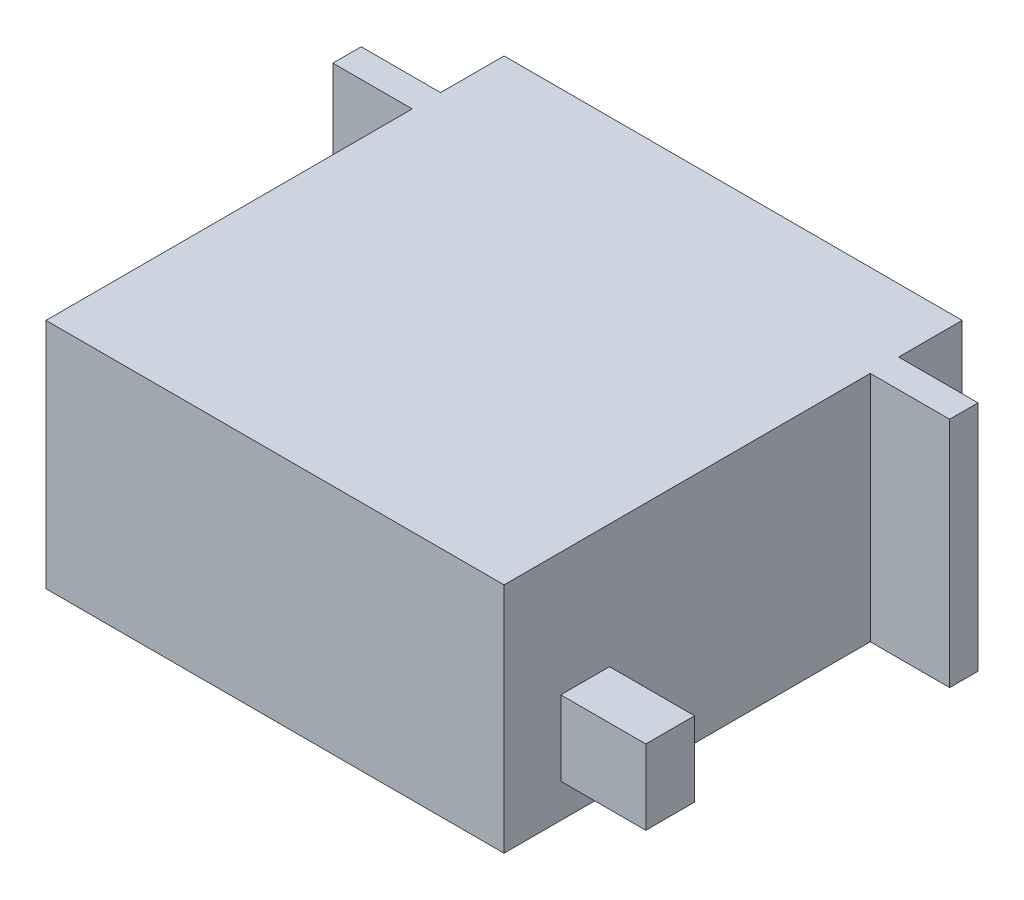
ISO-10303-21;
HEADER;
FILE_DESCRIPTION(('STEP AP214'),'2;1');
FILE_NAME('part.step','',(''),(''),'','','');
FILE_SCHEMA(('AUTOMOTIVE_DESIGN { 1 0 10303 214 1 1 1 1 }'));
ENDSEC;
DATA;
#1=APPLICATION_CONTEXT('core data for automotive mechanical design processes');
#2=APPLICATION_PROTOCOL_DEFINITION('international standard','automotive_design',2000,#1);
#3=PRODUCT_CONTEXT('',#1,'mechanical');
#4=PRODUCT('Part','Part','',(#3));
#5=PRODUCT_RELATED_PRODUCT_CATEGORY('part','',(#4));
#6=PRODUCT_DEFINITION_FORMATION('','',#4);
#7=PRODUCT_DEFINITION_CONTEXT('part definition',#1,'design');
#8=PRODUCT_DEFINITION('design','',#6,#7);
#9=PRODUCT_DEFINITION_SHAPE('','',#8);
#10=(LENGTH_UNIT() NAMED_UNIT(*) SI_UNIT(.MILLI.,.METRE.));
#11=(NAMED_UNIT(*) PLANE_ANGLE_UNIT() SI_UNIT($,.RADIAN.));
#12=(NAMED_UNIT(*) SI_UNIT($,.STERADIAN.) SOLID_ANGLE_UNIT());
#13=UNCERTAINTY_MEASURE_WITH_UNIT(LENGTH_MEASURE(1.E-05),#10,'distance_accuracy_value','');
#14=(GEOMETRIC_REPRESENTATION_CONTEXT(3) GLOBAL_UNCERTAINTY_ASSIGNED_CONTEXT((#13)) GLOBAL_UNIT_ASSIGNED_CONTEXT((#10,
#11,#12)) REPRESENTATION_CONTEXT('',''));
#15=CARTESIAN_POINT('',(0.,0.,0.));
#16=DIRECTION('',(0.,0.,1.));
#17=DIRECTION('',(1.,0.,0.));
#18=AXIS2_PLACEMENT_3D('',#15,#16,#17);
#19=CARTESIAN_POINT('',(17.745348870086,20.5,0.));
#20=DIRECTION('',(1.,0.,0.));
#21=DIRECTION('',(0.,0.,-1.));
#22=AXIS2_PLACEMENT_3D('',#19,#20,#21);
#23=PLANE('',#22);
#24=DIRECTION('',(0.,0.,1.));
#25=VECTOR('',#24,1.);
#26=CARTESIAN_POINT('',(17.745348870086,0.,0.));
#27=LINE('',#26,#25);
#28=CARTESIAN_POINT('',(17.745348870086,0.,-3.96373257406587));
#29=VERTEX_POINT('',#28);
#30=CARTESIAN_POINT('',(17.745348870086,0.,28.3362674259341));
#31=VERTEX_POINT('',#30);
#32=EDGE_CURVE('E199',#29,#31,#27,.T.);
#33=ORIENTED_EDGE('',*,*,#32,.F.);
#34=DIRECTION('',(0.,-1.,0.));
#35=VECTOR('',#34,1.);
#36=CARTESIAN_POINT('',(17.745348870086,20.5,-3.96373257406587));
#37=LINE('',#36,#35);
#38=CARTESIAN_POINT('',(17.745348870086,20.5,-3.96373257406587));
#39=VERTEX_POINT('',#38);
#40=EDGE_CURVE('E238',#39,#29,#37,.T.);
#41=ORIENTED_EDGE('',*,*,#40,.F.);
#42=DIRECTION('',(0.,0.,1.));
#43=VECTOR('',#42,1.);
#44=CARTESIAN_POINT('',(17.745348870086,20.5,0.));
#45=LINE('',#44,#43);
#46=CARTESIAN_POINT('',(17.745348870086,20.5,28.3362674259341));
#47=VERTEX_POINT('',#46);
#48=EDGE_CURVE('E178',#39,#47,#45,.T.);
#49=ORIENTED_EDGE('',*,*,#48,.T.);
#50=DIRECTION('',(0.,-1.,0.));
#51=VECTOR('',#50,1.);
#52=CARTESIAN_POINT('',(17.745348870086,20.5,28.3362674259341));
#53=LINE('',#52,#51);
#54=EDGE_CURVE('E241',#47,#31,#53,.T.);
#55=ORIENTED_EDGE('',*,*,#54,.T.);
#56=EDGE_LOOP('',(#33,#41,#49,#55));
#57=FACE_BOUND('',#56,.T.);
#58=DIRECTION('',(0.,0.,1.));
#59=VECTOR('',#58,1.);
#60=CARTESIAN_POINT('',(17.745348870086,9.6,19.0362674259341));
#61=LINE('',#60,#59);
#62=CARTESIAN_POINT('',(17.745348870086,9.6,19.0362674259341));
#63=VERTEX_POINT('',#62);
#64=CARTESIAN_POINT('',(17.745348870086,9.6,23.3362674259341));
#65=VERTEX_POINT('',#64);
#66=EDGE_CURVE('E328',#63,#65,#61,.T.);
#67=ORIENTED_EDGE('',*,*,#66,.F.);
#68=DIRECTION('',(0.,1.,0.));
#69=VECTOR('',#68,1.);
#70=CARTESIAN_POINT('',(17.745348870086,9.6,19.0362674259341));
#71=LINE('',#70,#69);
#72=CARTESIAN_POINT('',(17.745348870086,3.,19.0362674259341));
#73=VERTEX_POINT('',#72);
#74=EDGE_CURVE('E332',#73,#63,#71,.T.);
#75=ORIENTED_EDGE('',*,*,#74,.F.);
#76=DIRECTION('',(0.,0.,-1.));
#77=VECTOR('',#76,1.);
#78=CARTESIAN_POINT('',(17.745348870086,3.,19.0362674259341));
#79=LINE('',#78,#77);
#80=CARTESIAN_POINT('',(17.745348870086,3.,23.3362674259341));
#81=VERTEX_POINT('',#80);
#82=EDGE_CURVE('E322',#81,#73,#79,.T.);
#83=ORIENTED_EDGE('',*,*,#82,.F.);
#84=DIRECTION('',(0.,-1.,0.));
#85=VECTOR('',#84,1.);
#86=CARTESIAN_POINT('',(17.745348870086,9.6,23.3362674259341));
#87=LINE('',#86,#85);
#88=EDGE_CURVE('E325',#65,#81,#87,.T.);
#89=ORIENTED_EDGE('',*,*,#88,.F.);
#90=EDGE_LOOP('',(#67,#75,#83,#89));
#91=FACE_BOUND('',#90,.T.);
#92=ADVANCED_FACE('F39',(#57,#91),#23,.T.);
#93=CARTESIAN_POINT('',(-29.654651129914,20.5,0.));
#94=DIRECTION('',(1.,0.,0.));
#95=DIRECTION('',(0.,0.,-1.));
#96=AXIS2_PLACEMENT_3D('',#93,#94,#95);
#97=PLANE('',#96);
#98=DIRECTION('',(0.,0.,1.));
#99=VECTOR('',#98,1.);
#100=CARTESIAN_POINT('',(-29.654651129914,0.,0.));
#101=LINE('',#100,#99);
#102=CARTESIAN_POINT('',(-29.654651129914,0.,-6.46373257406587));
#103=VERTEX_POINT('',#102);
#104=CARTESIAN_POINT('',(-29.654651129914,0.,-3.96373257406587));
#105=VERTEX_POINT('',#104);
#106=EDGE_CURVE('E184',#103,#105,#101,.T.);
#107=ORIENTED_EDGE('',*,*,#106,.T.);
#108=DIRECTION('',(0.,-1.,0.));
#109=VECTOR('',#108,1.);
#110=CARTESIAN_POINT('',(-29.654651129914,20.5,-3.96373257406587));
#111=LINE('',#110,#109);
#112=CARTESIAN_POINT('',(-29.654651129914,20.5,-3.96373257406587));
#113=VERTEX_POINT('',#112);
#114=EDGE_CURVE('E11',#113,#105,#111,.T.);
#115=ORIENTED_EDGE('',*,*,#114,.F.);
#116=DIRECTION('',(0.,0.,1.));
#117=VECTOR('',#116,1.);
#118=CARTESIAN_POINT('',(-29.654651129914,20.5,0.));
#119=LINE('',#118,#117);
#120=CARTESIAN_POINT('',(-29.654651129914,20.5,-6.46373257406587));
#121=VERTEX_POINT('',#120);
#122=EDGE_CURVE('E222',#121,#113,#119,.T.);
#123=ORIENTED_EDGE('',*,*,#122,.F.);
#124=DIRECTION('',(0.,-1.,0.));
#125=VECTOR('',#124,1.);
#126=CARTESIAN_POINT('',(-29.654651129914,20.5,-6.46373257406587));
#127=LINE('',#126,#125);
#128=EDGE_CURVE('E64',#121,#103,#127,.T.);
#129=ORIENTED_EDGE('',*,*,#128,.T.);
#130=EDGE_LOOP('',(#107,#115,#123,#129));
#131=FACE_BOUND('',#130,.T.);
#132=ADVANCED_FACE('F41',(#131),#97,.F.);
#133=CARTESIAN_POINT('',(0.,20.5,-3.96373257406587));
#134=DIRECTION('',(0.,0.,-1.));
#135=DIRECTION('',(-1.,0.,0.));
#136=AXIS2_PLACEMENT_3D('',#133,#134,#135);
#137=PLANE('',#136);
#138=DIRECTION('',(1.,0.,0.));
#139=VECTOR('',#138,1.);
#140=CARTESIAN_POINT('',(0.,0.,-3.96373257406587));
#141=LINE('',#140,#139);
#142=CARTESIAN_POINT('',(-22.654651129914,0.,-3.96373257406587));
#143=VERTEX_POINT('',#142);
#144=EDGE_CURVE('E187',#105,#143,#141,.T.);
#145=ORIENTED_EDGE('',*,*,#144,.T.);
#146=DIRECTION('',(0.,-1.,0.));
#147=VECTOR('',#146,1.);
#148=CARTESIAN_POINT('',(-22.654651129914,20.5,-3.96373257406587));
#149=LINE('',#148,#147);
#150=CARTESIAN_POINT('',(-22.654651129914,20.5,-3.96373257406587));
#151=VERTEX_POINT('',#150);
#152=EDGE_CURVE('E48',#151,#143,#149,.T.);
#153=ORIENTED_EDGE('',*,*,#152,.F.);
#154=DIRECTION('',(1.,0.,0.));
#155=VECTOR('',#154,1.);
#156=CARTESIAN_POINT('',(0.,20.5,-3.96373257406587));
#157=LINE('',#156,#155);
#158=EDGE_CURVE('E115',#113,#151,#157,.T.);
#159=ORIENTED_EDGE('',*,*,#158,.F.);
#160=ORIENTED_EDGE('',*,*,#114,.T.);
#161=EDGE_LOOP('',(#145,#153,#159,#160));
#162=FACE_BOUND('',#161,.T.);
#163=ADVANCED_FACE('F349',(#162),#137,.F.);
#164=CARTESIAN_POINT('',(-22.654651129914,20.5,0.));
#165=DIRECTION('',(1.,0.,0.));
#166=DIRECTION('',(0.,0.,-1.));
#167=AXIS2_PLACEMENT_3D('',#164,#165,#166);
#168=PLANE('',#167);
#169=DIRECTION('',(0.,0.,1.));
#170=VECTOR('',#169,1.);
#171=CARTESIAN_POINT('',(-22.654651129914,0.,0.));
#172=LINE('',#171,#170);
#173=CARTESIAN_POINT('',(-22.654651129914,0.,28.3362674259341));
#174=VERTEX_POINT('',#173);
#175=EDGE_CURVE('E191',#143,#174,#172,.T.);
#176=ORIENTED_EDGE('',*,*,#175,.T.);
#177=DIRECTION('',(0.,-1.,0.));
#178=VECTOR('',#177,1.);
#179=CARTESIAN_POINT('',(-22.654651129914,20.5,28.3362674259341));
#180=LINE('',#179,#178);
#181=CARTESIAN_POINT('',(-22.654651129914,20.5,28.3362674259341));
#182=VERTEX_POINT('',#181);
#183=EDGE_CURVE('E244',#182,#174,#180,.T.);
#184=ORIENTED_EDGE('',*,*,#183,.F.);
#185=DIRECTION('',(0.,0.,1.));
#186=VECTOR('',#185,1.);
#187=CARTESIAN_POINT('',(-22.654651129914,20.5,0.));
#188=LINE('',#187,#186);
#189=EDGE_CURVE('E168',#151,#182,#188,.T.);
#190=ORIENTED_EDGE('',*,*,#189,.F.);
#191=ORIENTED_EDGE('',*,*,#152,.T.);
#192=EDGE_LOOP('',(#176,#184,#190,#191));
#193=FACE_BOUND('',#192,.T.);
#194=ADVANCED_FACE('F252',(#193),#168,.F.);
#195=CARTESIAN_POINT('',(0.,20.5,28.3362674259341));
#196=DIRECTION('',(0.,0.,-1.));
#197=DIRECTION('',(-1.,0.,0.));
#198=AXIS2_PLACEMENT_3D('',#195,#196,#197);
#199=PLANE('',#198);
#200=DIRECTION('',(1.,0.,0.));
#201=VECTOR('',#200,1.);
#202=CARTESIAN_POINT('',(0.,0.,28.3362674259341));
#203=LINE('',#202,#201);
#204=EDGE_CURVE('E194',#174,#31,#203,.T.);
#205=ORIENTED_EDGE('',*,*,#204,.T.);
#206=ORIENTED_EDGE('',*,*,#54,.F.);
#207=DIRECTION('',(1.,0.,0.));
#208=VECTOR('',#207,1.);
#209=CARTESIAN_POINT('',(0.,20.5,28.3362674259341));
#210=LINE('',#209,#208);
#211=EDGE_CURVE('E263',#182,#47,#210,.T.);
#212=ORIENTED_EDGE('',*,*,#211,.F.);
#213=ORIENTED_EDGE('',*,*,#183,.T.);
#214=EDGE_LOOP('',(#205,#206,#212,#213));
#215=FACE_BOUND('',#214,.T.);
#216=ADVANCED_FACE('F260',(#215),#199,.F.);
#217=CARTESIAN_POINT('',(0.,20.5,-3.96373257406587));
#218=DIRECTION('',(0.,0.,1.));
#219=DIRECTION('',(1.,0.,0.));
#220=AXIS2_PLACEMENT_3D('',#217,#218,#219);
#221=PLANE('',#220);
#222=DIRECTION('',(-1.,0.,0.));
#223=VECTOR('',#222,1.);
#224=CARTESIAN_POINT('',(0.,0.,-3.96373257406587));
#225=LINE('',#224,#223);
#226=CARTESIAN_POINT('',(24.745348870086,0.,-3.96373257406587));
#227=VERTEX_POINT('',#226);
#228=EDGE_CURVE('E203',#227,#29,#225,.T.);
#229=ORIENTED_EDGE('',*,*,#228,.F.);
#230=DIRECTION('',(0.,-1.,0.));
#231=VECTOR('',#230,1.);
#232=CARTESIAN_POINT('',(24.745348870086,20.5,-3.96373257406587));
#233=LINE('',#232,#231);
#234=CARTESIAN_POINT('',(24.745348870086,20.5,-3.96373257406587));
#235=VERTEX_POINT('',#234);
#236=EDGE_CURVE('E235',#235,#227,#233,.T.);
#237=ORIENTED_EDGE('',*,*,#236,.F.);
#238=DIRECTION('',(-1.,0.,0.));
#239=VECTOR('',#238,1.);
#240=CARTESIAN_POINT('',(0.,20.5,-3.96373257406587));
#241=LINE('',#240,#239);
#242=EDGE_CURVE('E269',#235,#39,#241,.T.);
#243=ORIENTED_EDGE('',*,*,#242,.T.);
#244=ORIENTED_EDGE('',*,*,#40,.T.);
#245=EDGE_LOOP('',(#229,#237,#243,#244));
#246=FACE_BOUND('',#245,.T.);
#247=ADVANCED_FACE('F375',(#246),#221,.T.);
#248=CARTESIAN_POINT('',(24.745348870086,20.5,0.));
#249=DIRECTION('',(1.,0.,0.));
#250=DIRECTION('',(0.,0.,-1.));
#251=AXIS2_PLACEMENT_3D('',#248,#249,#250);
#252=PLANE('',#251);
#253=DIRECTION('',(0.,0.,1.));
#254=VECTOR('',#253,1.);
#255=CARTESIAN_POINT('',(24.745348870086,0.,0.));
#256=LINE('',#255,#254);
#257=CARTESIAN_POINT('',(24.745348870086,0.,-6.46373257406587));
#258=VERTEX_POINT('',#257);
#259=EDGE_CURVE('E208',#258,#227,#256,.T.);
#260=ORIENTED_EDGE('',*,*,#259,.F.);
#261=DIRECTION('',(0.,-1.,0.));
#262=VECTOR('',#261,1.);
#263=CARTESIAN_POINT('',(24.745348870086,20.5,-6.46373257406587));
#264=LINE('',#263,#262);
#265=CARTESIAN_POINT('',(24.745348870086,20.5,-6.46373257406587));
#266=VERTEX_POINT('',#265);
#267=EDGE_CURVE('E232',#266,#258,#264,.T.);
#268=ORIENTED_EDGE('',*,*,#267,.F.);
#269=DIRECTION('',(0.,0.,1.));
#270=VECTOR('',#269,1.);
#271=CARTESIAN_POINT('',(24.745348870086,20.5,0.));
#272=LINE('',#271,#270);
#273=EDGE_CURVE('E274',#266,#235,#272,.T.);
#274=ORIENTED_EDGE('',*,*,#273,.T.);
#275=ORIENTED_EDGE('',*,*,#236,.T.);
#276=EDGE_LOOP('',(#260,#268,#274,#275));
#277=FACE_BOUND('',#276,.T.);
#278=ADVANCED_FACE('F371',(#277),#252,.T.);
#279=CARTESIAN_POINT('',(0.,20.5,-6.46373257406587));
#280=DIRECTION('',(0.,0.,1.));
#281=DIRECTION('',(1.,0.,0.));
#282=AXIS2_PLACEMENT_3D('',#279,#280,#281);
#283=PLANE('',#282);
#284=DIRECTION('',(-1.,0.,0.));
#285=VECTOR('',#284,1.);
#286=CARTESIAN_POINT('',(0.,0.,-6.46373257406587));
#287=LINE('',#286,#285);
#288=CARTESIAN_POINT('',(17.745348870086,0.,-6.46373257406587));
#289=VERTEX_POINT('',#288);
#290=EDGE_CURVE('E212',#258,#289,#287,.T.);
#291=ORIENTED_EDGE('',*,*,#290,.T.);
#292=DIRECTION('',(0.,-1.,0.));
#293=VECTOR('',#292,1.);
#294=CARTESIAN_POINT('',(17.745348870086,20.5,-6.46373257406587));
#295=LINE('',#294,#293);
#296=CARTESIAN_POINT('',(17.745348870086,20.5,-6.46373257406587));
#297=VERTEX_POINT('',#296);
#298=EDGE_CURVE('E229',#297,#289,#295,.T.);
#299=ORIENTED_EDGE('',*,*,#298,.F.);
#300=DIRECTION('',(-1.,0.,0.));
#301=VECTOR('',#300,1.);
#302=CARTESIAN_POINT('',(0.,20.5,-6.46373257406587));
#303=LINE('',#302,#301);
#304=EDGE_CURVE('E176',#266,#297,#303,.T.);
#305=ORIENTED_EDGE('',*,*,#304,.F.);
#306=ORIENTED_EDGE('',*,*,#267,.T.);
#307=EDGE_LOOP('',(#291,#299,#305,#306));
#308=FACE_BOUND('',#307,.T.);
#309=ADVANCED_FACE('F284',(#308),#283,.F.);
#310=CARTESIAN_POINT('',(17.745348870086,0.,-12.0637325740659));
#311=VERTEX_POINT('',#310);
#312=EDGE_CURVE('E204',#311,#289,#27,.T.);
#313=ORIENTED_EDGE('',*,*,#312,.F.);
#314=DIRECTION('',(0.,-1.,0.));
#315=VECTOR('',#314,1.);
#316=CARTESIAN_POINT('',(17.745348870086,20.5,-12.0637325740659));
#317=LINE('',#316,#315);
#318=CARTESIAN_POINT('',(17.745348870086,20.5,-12.0637325740659));
#319=VERTEX_POINT('',#318);
#320=EDGE_CURVE('E157',#319,#311,#317,.T.);
#321=ORIENTED_EDGE('',*,*,#320,.F.);
#322=EDGE_CURVE('E172',#319,#297,#45,.T.);
#323=ORIENTED_EDGE('',*,*,#322,.T.);
#324=ORIENTED_EDGE('',*,*,#298,.T.);
#325=EDGE_LOOP('',(#313,#321,#323,#324));
#326=FACE_BOUND('',#325,.T.);
#327=ADVANCED_FACE('F289',(#326),#23,.T.);
#328=CARTESIAN_POINT('',(0.,20.5,-12.0637325740659));
#329=DIRECTION('',(0.,0.,-1.));
#330=DIRECTION('',(-1.,0.,0.));
#331=AXIS2_PLACEMENT_3D('',#328,#329,#330);
#332=PLANE('',#331);
#333=CARTESIAN_POINT('',(8.24534887008598,11.,-12.0637325740659));
#334=DIRECTION('',(0.,0.,-1.));
#335=DIRECTION('',(-1.,0.,0.));
#336=AXIS2_PLACEMENT_3D('',#333,#334,#335);
#337=CIRCLE('',#336,3.);
#338=CARTESIAN_POINT('',(5.24534887008598,11.,-12.0637325740659));
#339=VERTEX_POINT('',#338);
#340=EDGE_CURVE('E340',#339,#339,#337,.T.);
#341=ORIENTED_EDGE('',*,*,#340,.F.);
#342=EDGE_LOOP('',(#341));
#343=FACE_BOUND('',#342,.T.);
#344=DIRECTION('',(1.,0.,0.));
#345=VECTOR('',#344,1.);
#346=CARTESIAN_POINT('',(0.,0.,-12.0637325740659));
#347=LINE('',#346,#345);
#348=CARTESIAN_POINT('',(-22.654651129914,0.,-12.0637325740659));
#349=VERTEX_POINT('',#348);
#350=EDGE_CURVE('E152',#349,#311,#347,.T.);
#351=ORIENTED_EDGE('',*,*,#350,.F.);
#352=DIRECTION('',(0.,-1.,0.));
#353=VECTOR('',#352,1.);
#354=CARTESIAN_POINT('',(-22.654651129914,20.5,-12.0637325740659));
#355=LINE('',#354,#353);
#356=CARTESIAN_POINT('',(-22.654651129914,20.5,-12.0637325740659));
#357=VERTEX_POINT('',#356);
#358=EDGE_CURVE('E146',#357,#349,#355,.T.);
#359=ORIENTED_EDGE('',*,*,#358,.F.);
#360=DIRECTION('',(1.,0.,0.));
#361=VECTOR('',#360,1.);
#362=CARTESIAN_POINT('',(0.,20.5,-12.0637325740659));
#363=LINE('',#362,#361);
#364=EDGE_CURVE('E150',#357,#319,#363,.T.);
#365=ORIENTED_EDGE('',*,*,#364,.T.);
#366=ORIENTED_EDGE('',*,*,#320,.T.);
#367=EDGE_LOOP('',(#351,#359,#365,#366));
#368=FACE_BOUND('',#367,.T.);
#369=ADVANCED_FACE('F148',(#343,#368),#332,.T.);
#370=CARTESIAN_POINT('',(-22.654651129914,0.,-6.46373257406587));
#371=VERTEX_POINT('',#370);
#372=EDGE_CURVE('E195',#349,#371,#172,.T.);
#373=ORIENTED_EDGE('',*,*,#372,.T.);
#374=DIRECTION('',(0.,-1.,0.));
#375=VECTOR('',#374,1.);
#376=CARTESIAN_POINT('',(-22.654651129914,20.5,-6.46373257406587));
#377=LINE('',#376,#375);
#378=CARTESIAN_POINT('',(-22.654651129914,20.5,-6.46373257406587));
#379=VERTEX_POINT('',#378);
#380=EDGE_CURVE('E158',#379,#371,#377,.T.);
#381=ORIENTED_EDGE('',*,*,#380,.F.);
#382=EDGE_CURVE('E161',#357,#379,#188,.T.);
#383=ORIENTED_EDGE('',*,*,#382,.F.);
#384=ORIENTED_EDGE('',*,*,#358,.T.);
#385=EDGE_LOOP('',(#373,#381,#383,#384));
#386=FACE_BOUND('',#385,.T.);
#387=ADVANCED_FACE('F162',(#386),#168,.F.);
#388=CARTESIAN_POINT('',(0.,20.5,-6.46373257406587));
#389=DIRECTION('',(0.,0.,-1.));
#390=DIRECTION('',(-1.,0.,0.));
#391=AXIS2_PLACEMENT_3D('',#388,#389,#390);
#392=PLANE('',#391);
#393=DIRECTION('',(1.,0.,0.));
#394=VECTOR('',#393,1.);
#395=CARTESIAN_POINT('',(0.,0.,-6.46373257406587));
#396=LINE('',#395,#394);
#397=EDGE_CURVE('E218',#103,#371,#396,.T.);
#398=ORIENTED_EDGE('',*,*,#397,.F.);
#399=ORIENTED_EDGE('',*,*,#128,.F.);
#400=DIRECTION('',(1.,0.,0.));
#401=VECTOR('',#400,1.);
#402=CARTESIAN_POINT('',(0.,20.5,-6.46373257406587));
#403=LINE('',#402,#401);
#404=EDGE_CURVE('E166',#121,#379,#403,.T.);
#405=ORIENTED_EDGE('',*,*,#404,.T.);
#406=ORIENTED_EDGE('',*,*,#380,.T.);
#407=EDGE_LOOP('',(#398,#399,#405,#406));
#408=FACE_BOUND('',#407,.T.);
#409=ADVANCED_FACE('F413',(#408),#392,.T.);
#410=CARTESIAN_POINT('',(0.,20.5,0.));
#411=DIRECTION('',(0.,1.,0.));
#412=DIRECTION('',(0.,0.,1.));
#413=AXIS2_PLACEMENT_3D('',#410,#411,#412);
#414=PLANE('',#413);
#415=ORIENTED_EDGE('',*,*,#122,.T.);
#416=ORIENTED_EDGE('',*,*,#158,.T.);
#417=ORIENTED_EDGE('',*,*,#189,.T.);
#418=ORIENTED_EDGE('',*,*,#211,.T.);
#419=ORIENTED_EDGE('',*,*,#48,.F.);
#420=ORIENTED_EDGE('',*,*,#242,.F.);
#421=ORIENTED_EDGE('',*,*,#273,.F.);
#422=ORIENTED_EDGE('',*,*,#304,.T.);
#423=ORIENTED_EDGE('',*,*,#322,.F.);
#424=ORIENTED_EDGE('',*,*,#364,.F.);
#425=ORIENTED_EDGE('',*,*,#382,.T.);
#426=ORIENTED_EDGE('',*,*,#404,.F.);
#427=EDGE_LOOP('',(#415,#416,#417,#418,#419,#420,#421,#422,#423,#424,#425,#426));
#428=FACE_BOUND('',#427,.T.);
#429=ADVANCED_FACE('F170',(#428),#414,.T.);
#430=CARTESIAN_POINT('',(0.,0.,0.));
#431=DIRECTION('',(0.,1.,0.));
#432=DIRECTION('',(0.,0.,1.));
#433=AXIS2_PLACEMENT_3D('',#430,#431,#432);
#434=PLANE('',#433);
#435=ORIENTED_EDGE('',*,*,#106,.F.);
#436=ORIENTED_EDGE('',*,*,#397,.T.);
#437=ORIENTED_EDGE('',*,*,#372,.F.);
#438=ORIENTED_EDGE('',*,*,#350,.T.);
#439=ORIENTED_EDGE('',*,*,#312,.T.);
#440=ORIENTED_EDGE('',*,*,#290,.F.);
#441=ORIENTED_EDGE('',*,*,#259,.T.);
#442=ORIENTED_EDGE('',*,*,#228,.T.);
#443=ORIENTED_EDGE('',*,*,#32,.T.);
#444=ORIENTED_EDGE('',*,*,#204,.F.);
#445=ORIENTED_EDGE('',*,*,#175,.F.);
#446=ORIENTED_EDGE('',*,*,#144,.F.);
#447=EDGE_LOOP('',(#435,#436,#437,#438,#439,#440,#441,#442,#443,#444,#445,#446));
#448=FACE_BOUND('',#447,.T.);
#449=ADVANCED_FACE('F256',(#448),#434,.F.);
#450=CARTESIAN_POINT('',(25.245348870086,9.6,19.0362674259341));
#451=DIRECTION('',(0.,0.,1.));
#452=DIRECTION('',(1.,0.,0.));
#453=AXIS2_PLACEMENT_3D('',#450,#451,#452);
#454=PLANE('',#453);
#455=ORIENTED_EDGE('',*,*,#74,.T.);
#456=DIRECTION('',(-1.,0.,0.));
#457=VECTOR('',#456,1.);
#458=CARTESIAN_POINT('',(25.245348870086,9.6,19.0362674259341));
#459=LINE('',#458,#457);
#460=CARTESIAN_POINT('',(25.245348870086,9.6,19.0362674259341));
#461=VERTEX_POINT('',#460);
#462=EDGE_CURVE('E188',#461,#63,#459,.T.);
#463=ORIENTED_EDGE('',*,*,#462,.F.);
#464=DIRECTION('',(0.,1.,0.));
#465=VECTOR('',#464,1.);
#466=CARTESIAN_POINT('',(25.245348870086,9.6,19.0362674259341));
#467=LINE('',#466,#465);
#468=CARTESIAN_POINT('',(25.245348870086,3.,19.0362674259341));
#469=VERTEX_POINT('',#468);
#470=EDGE_CURVE('E318',#469,#461,#467,.T.);
#471=ORIENTED_EDGE('',*,*,#470,.F.);
#472=DIRECTION('',(-1.,0.,0.));
#473=VECTOR('',#472,1.);
#474=CARTESIAN_POINT('',(25.245348870086,3.,19.0362674259341));
#475=LINE('',#474,#473);
#476=EDGE_CURVE('E302',#469,#73,#475,.T.);
#477=ORIENTED_EDGE('',*,*,#476,.T.);
#478=EDGE_LOOP('',(#455,#463,#471,#477));
#479=FACE_BOUND('',#478,.T.);
#480=ADVANCED_FACE('F440',(#479),#454,.F.);
#481=CARTESIAN_POINT('',(25.245348870086,9.6,19.0362674259341));
#482=DIRECTION('',(0.,-1.,0.));
#483=DIRECTION('',(0.,0.,-1.));
#484=AXIS2_PLACEMENT_3D('',#481,#482,#483);
#485=PLANE('',#484);
#486=ORIENTED_EDGE('',*,*,#66,.T.);
#487=DIRECTION('',(-1.,0.,0.));
#488=VECTOR('',#487,1.);
#489=CARTESIAN_POINT('',(25.245348870086,9.6,23.3362674259341));
#490=LINE('',#489,#488);
#491=CARTESIAN_POINT('',(25.245348870086,9.6,23.3362674259341));
#492=VERTEX_POINT('',#491);
#493=EDGE_CURVE('E296',#492,#65,#490,.T.);
#494=ORIENTED_EDGE('',*,*,#493,.F.);
#495=DIRECTION('',(0.,0.,1.));
#496=VECTOR('',#495,1.);
#497=CARTESIAN_POINT('',(25.245348870086,9.6,19.0362674259341));
#498=LINE('',#497,#496);
#499=EDGE_CURVE('E314',#461,#492,#498,.T.);
#500=ORIENTED_EDGE('',*,*,#499,.F.);
#501=ORIENTED_EDGE('',*,*,#462,.T.);
#502=EDGE_LOOP('',(#486,#494,#500,#501));
#503=FACE_BOUND('',#502,.T.);
#504=ADVANCED_FACE('F457',(#503),#485,.F.);
#505=CARTESIAN_POINT('',(25.245348870086,9.6,23.3362674259341));
#506=DIRECTION('',(0.,0.,-1.));
#507=DIRECTION('',(-1.,0.,0.));
#508=AXIS2_PLACEMENT_3D('',#505,#506,#507);
#509=PLANE('',#508);
#510=ORIENTED_EDGE('',*,*,#88,.T.);
#511=DIRECTION('',(-1.,0.,0.));
#512=VECTOR('',#511,1.);
#513=CARTESIAN_POINT('',(25.245348870086,3.,23.3362674259341));
#514=LINE('',#513,#512);
#515=CARTESIAN_POINT('',(25.245348870086,3.,23.3362674259341));
#516=VERTEX_POINT('',#515);
#517=EDGE_CURVE('E55',#516,#81,#514,.T.);
#518=ORIENTED_EDGE('',*,*,#517,.F.);
#519=DIRECTION('',(0.,-1.,0.));
#520=VECTOR('',#519,1.);
#521=CARTESIAN_POINT('',(25.245348870086,9.6,23.3362674259341));
#522=LINE('',#521,#520);
#523=EDGE_CURVE('E310',#492,#516,#522,.T.);
#524=ORIENTED_EDGE('',*,*,#523,.F.);
#525=ORIENTED_EDGE('',*,*,#493,.T.);
#526=EDGE_LOOP('',(#510,#518,#524,#525));
#527=FACE_BOUND('',#526,.T.);
#528=ADVANCED_FACE('F467',(#527),#509,.F.);
#529=CARTESIAN_POINT('',(25.245348870086,3.,19.0362674259341));
#530=DIRECTION('',(0.,1.,0.));
#531=DIRECTION('',(0.,0.,1.));
#532=AXIS2_PLACEMENT_3D('',#529,#530,#531);
#533=PLANE('',#532);
#534=ORIENTED_EDGE('',*,*,#82,.T.);
#535=ORIENTED_EDGE('',*,*,#476,.F.);
#536=DIRECTION('',(0.,0.,-1.));
#537=VECTOR('',#536,1.);
#538=CARTESIAN_POINT('',(25.245348870086,3.,19.0362674259341));
#539=LINE('',#538,#537);
#540=EDGE_CURVE('E306',#516,#469,#539,.T.);
#541=ORIENTED_EDGE('',*,*,#540,.F.);
#542=ORIENTED_EDGE('',*,*,#517,.T.);
#543=EDGE_LOOP('',(#534,#535,#541,#542));
#544=FACE_BOUND('',#543,.T.);
#545=ADVANCED_FACE('F477',(#544),#533,.F.);
#546=CARTESIAN_POINT('',(25.245348870086,0.,0.));
#547=DIRECTION('',(-1.,0.,0.));
#548=DIRECTION('',(0.,0.,1.));
#549=AXIS2_PLACEMENT_3D('',#546,#547,#548);
#550=PLANE('',#549);
#551=ORIENTED_EDGE('',*,*,#470,.T.);
#552=ORIENTED_EDGE('',*,*,#499,.T.);
#553=ORIENTED_EDGE('',*,*,#523,.T.);
#554=ORIENTED_EDGE('',*,*,#540,.T.);
#555=EDGE_LOOP('',(#551,#552,#553,#554));
#556=FACE_BOUND('',#555,.T.);
#557=ADVANCED_FACE('F487',(#556),#550,.F.);
#558=CARTESIAN_POINT('',(8.24534887008598,11.,-18.4637325740659));
#559=DIRECTION('',(0.,0.,1.));
#560=DIRECTION('',(1.,0.,0.));
#561=AXIS2_PLACEMENT_3D('',#558,#559,#560);
#562=CYLINDRICAL_SURFACE('',#561,3.);
#563=CARTESIAN_POINT('',(8.24534887008598,11.,-18.4637325740659));
#564=DIRECTION('',(0.,0.,-1.));
#565=DIRECTION('',(-1.,0.,0.));
#566=AXIS2_PLACEMENT_3D('',#563,#564,#565);
#567=CIRCLE('',#566,3.);
#568=CARTESIAN_POINT('',(5.24534887008598,11.,-18.4637325740659));
#569=VERTEX_POINT('',#568);
#570=EDGE_CURVE('E336',#569,#569,#567,.T.);
#571=ORIENTED_EDGE('',*,*,#570,.F.);
#572=EDGE_LOOP('',(#571));
#573=FACE_BOUND('',#572,.T.);
#574=ORIENTED_EDGE('',*,*,#340,.T.);
#575=EDGE_LOOP('',(#574));
#576=FACE_BOUND('',#575,.T.);
#577=ADVANCED_FACE('F496',(#573,#576),#562,.T.);
#578=CARTESIAN_POINT('',(8.24534887008598,11.,-18.4637325740659));
#579=DIRECTION('',(0.,0.,-1.));
#580=DIRECTION('',(-1.,0.,0.));
#581=AXIS2_PLACEMENT_3D('',#578,#579,#580);
#582=PLANE('',#581);
#583=ORIENTED_EDGE('',*,*,#570,.T.);
#584=EDGE_LOOP('',(#583));
#585=FACE_BOUND('',#584,.T.);
#586=ADVANCED_FACE('F511',(#585),#582,.T.);
#587=CLOSED_SHELL('',(#92,#132,#163,#194,#216,#247,#278,#309,#327,#369,#387,#409,#429,#449,#480,
#504,#528,#545,#557,#577,#586));
#588=MANIFOLD_SOLID_BREP('B2',#587);
#589=ADVANCED_BREP_SHAPE_REPRESENTATION('',(#18,#588),#14);
#590=SHAPE_DEFINITION_REPRESENTATION(#9,#589);
ENDSEC;
END-ISO-10303-21;
